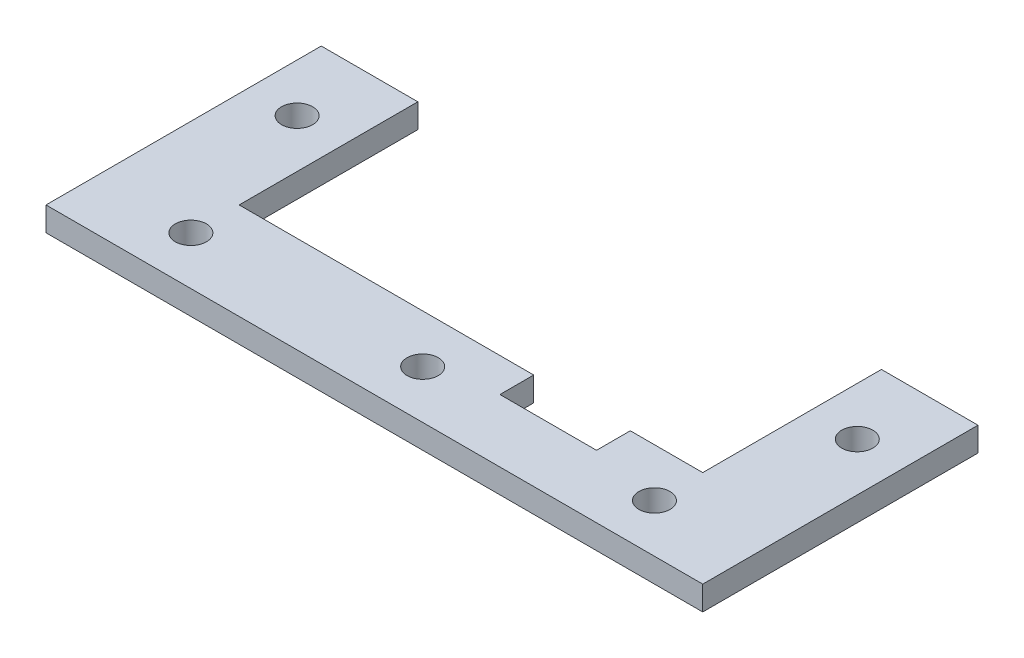
ISO-10303-21;
HEADER;
FILE_DESCRIPTION(('STEP AP214'),'2;1');
FILE_NAME('part.step','',(''),(''),'','','');
FILE_SCHEMA(('AUTOMOTIVE_DESIGN { 1 0 10303 214 1 1 1 1 }'));
ENDSEC;
DATA;
#1=APPLICATION_CONTEXT('core data for automotive mechanical design processes');
#2=APPLICATION_PROTOCOL_DEFINITION('international standard','automotive_design',2000,#1);
#3=PRODUCT_CONTEXT('',#1,'mechanical');
#4=PRODUCT('Part','Part','',(#3));
#5=PRODUCT_RELATED_PRODUCT_CATEGORY('part','',(#4));
#6=PRODUCT_DEFINITION_FORMATION('','',#4);
#7=PRODUCT_DEFINITION_CONTEXT('part definition',#1,'design');
#8=PRODUCT_DEFINITION('design','',#6,#7);
#9=PRODUCT_DEFINITION_SHAPE('','',#8);
#10=(LENGTH_UNIT() NAMED_UNIT(*) SI_UNIT(.MILLI.,.METRE.));
#11=(NAMED_UNIT(*) PLANE_ANGLE_UNIT() SI_UNIT($,.RADIAN.));
#12=(NAMED_UNIT(*) SI_UNIT($,.STERADIAN.) SOLID_ANGLE_UNIT());
#13=UNCERTAINTY_MEASURE_WITH_UNIT(LENGTH_MEASURE(1.E-05),#10,'distance_accuracy_value','');
#14=(GEOMETRIC_REPRESENTATION_CONTEXT(3) GLOBAL_UNCERTAINTY_ASSIGNED_CONTEXT((#13)) GLOBAL_UNIT_ASSIGNED_CONTEXT((#10,
#11,#12)) REPRESENTATION_CONTEXT('',''));
#15=CARTESIAN_POINT('',(0.,0.,0.));
#16=DIRECTION('',(0.,0.,1.));
#17=DIRECTION('',(1.,0.,0.));
#18=AXIS2_PLACEMENT_3D('',#15,#16,#17);
#19=CARTESIAN_POINT('',(0.,5.,37.));
#20=DIRECTION('',(0.,0.,1.));
#21=DIRECTION('',(1.,0.,0.));
#22=AXIS2_PLACEMENT_3D('',#19,#20,#21);
#23=PLANE('',#22);
#24=DIRECTION('',(-1.,0.,0.));
#25=VECTOR('',#24,1.);
#26=CARTESIAN_POINT('',(0.,0.,37.));
#27=LINE('',#26,#25);
#28=CARTESIAN_POINT('',(96.,0.,37.));
#29=VERTEX_POINT('',#28);
#30=CARTESIAN_POINT('',(81.,0.,37.));
#31=VERTEX_POINT('',#30);
#32=EDGE_CURVE('E181',#29,#31,#27,.T.);
#33=ORIENTED_EDGE('',*,*,#32,.T.);
#34=DIRECTION('',(0.,1.,0.));
#35=VECTOR('',#34,1.);
#36=CARTESIAN_POINT('',(81.,0.,37.));
#37=LINE('',#36,#35);
#38=CARTESIAN_POINT('',(81.,5.,37.));
#39=VERTEX_POINT('',#38);
#40=EDGE_CURVE('E229',#31,#39,#37,.T.);
#41=ORIENTED_EDGE('',*,*,#40,.T.);
#42=DIRECTION('',(-1.,0.,0.));
#43=VECTOR('',#42,1.);
#44=CARTESIAN_POINT('',(0.,5.,37.));
#45=LINE('',#44,#43);
#46=CARTESIAN_POINT('',(96.,5.,37.));
#47=VERTEX_POINT('',#46);
#48=EDGE_CURVE('E153',#47,#39,#45,.T.);
#49=ORIENTED_EDGE('',*,*,#48,.F.);
#50=DIRECTION('',(0.,-1.,0.));
#51=VECTOR('',#50,1.);
#52=CARTESIAN_POINT('',(96.,5.,37.));
#53=LINE('',#52,#51);
#54=EDGE_CURVE('E145',#47,#29,#53,.T.);
#55=ORIENTED_EDGE('',*,*,#54,.T.);
#56=EDGE_LOOP('',(#33,#41,#49,#55));
#57=FACE_BOUND('',#56,.T.);
#58=ADVANCED_FACE('F38',(#57),#23,.F.);
#59=CARTESIAN_POINT('',(0.,5.,0.));
#60=DIRECTION('',(-1.,0.,0.));
#61=DIRECTION('',(0.,0.,1.));
#62=AXIS2_PLACEMENT_3D('',#59,#60,#61);
#63=PLANE('',#62);
#64=DIRECTION('',(0.,0.,-1.));
#65=VECTOR('',#64,1.);
#66=CARTESIAN_POINT('',(0.,0.,0.));
#67=LINE('',#66,#65);
#68=CARTESIAN_POINT('',(0.,0.,37.));
#69=VERTEX_POINT('',#68);
#70=CARTESIAN_POINT('',(0.,0.,0.));
#71=VERTEX_POINT('',#70);
#72=EDGE_CURVE('E159',#69,#71,#67,.T.);
#73=ORIENTED_EDGE('',*,*,#72,.T.);
#74=DIRECTION('',(0.,-1.,0.));
#75=VECTOR('',#74,1.);
#76=CARTESIAN_POINT('',(0.,5.,0.));
#77=LINE('',#76,#75);
#78=CARTESIAN_POINT('',(0.,5.,0.));
#79=VERTEX_POINT('',#78);
#80=EDGE_CURVE('E11',#79,#71,#77,.T.);
#81=ORIENTED_EDGE('',*,*,#80,.F.);
#82=DIRECTION('',(0.,0.,-1.));
#83=VECTOR('',#82,1.);
#84=CARTESIAN_POINT('',(0.,5.,0.));
#85=LINE('',#84,#83);
#86=CARTESIAN_POINT('',(0.,5.,37.));
#87=VERTEX_POINT('',#86);
#88=EDGE_CURVE('E185',#87,#79,#85,.T.);
#89=ORIENTED_EDGE('',*,*,#88,.F.);
#90=DIRECTION('',(0.,-1.,0.));
#91=VECTOR('',#90,1.);
#92=CARTESIAN_POINT('',(0.,5.,37.));
#93=LINE('',#92,#91);
#94=EDGE_CURVE('E158',#87,#69,#93,.T.);
#95=ORIENTED_EDGE('',*,*,#94,.T.);
#96=EDGE_LOOP('',(#73,#81,#89,#95));
#97=FACE_BOUND('',#96,.T.);
#98=ADVANCED_FACE('F40',(#97),#63,.F.);
#99=CARTESIAN_POINT('',(0.,5.,0.));
#100=DIRECTION('',(0.,0.,1.));
#101=DIRECTION('',(1.,0.,0.));
#102=AXIS2_PLACEMENT_3D('',#99,#100,#101);
#103=PLANE('',#102);
#104=DIRECTION('',(-1.,0.,0.));
#105=VECTOR('',#104,1.);
#106=CARTESIAN_POINT('',(0.,0.,0.));
#107=LINE('',#106,#105);
#108=CARTESIAN_POINT('',(-20.,0.,0.));
#109=VERTEX_POINT('',#108);
#110=EDGE_CURVE('E163',#71,#109,#107,.T.);
#111=ORIENTED_EDGE('',*,*,#110,.T.);
#112=DIRECTION('',(0.,-1.,0.));
#113=VECTOR('',#112,1.);
#114=CARTESIAN_POINT('',(-20.,5.,0.));
#115=LINE('',#114,#113);
#116=CARTESIAN_POINT('',(-20.,5.,0.));
#117=VERTEX_POINT('',#116);
#118=EDGE_CURVE('E47',#117,#109,#115,.T.);
#119=ORIENTED_EDGE('',*,*,#118,.F.);
#120=DIRECTION('',(-1.,0.,0.));
#121=VECTOR('',#120,1.);
#122=CARTESIAN_POINT('',(0.,5.,0.));
#123=LINE('',#122,#121);
#124=EDGE_CURVE('E105',#79,#117,#123,.T.);
#125=ORIENTED_EDGE('',*,*,#124,.F.);
#126=ORIENTED_EDGE('',*,*,#80,.T.);
#127=EDGE_LOOP('',(#111,#119,#125,#126));
#128=FACE_BOUND('',#127,.T.);
#129=ADVANCED_FACE('F353',(#128),#103,.F.);
#130=CARTESIAN_POINT('',(-20.,5.,0.));
#131=DIRECTION('',(1.,0.,0.));
#132=DIRECTION('',(0.,0.,-1.));
#133=AXIS2_PLACEMENT_3D('',#130,#131,#132);
#134=PLANE('',#133);
#135=DIRECTION('',(0.,0.,1.));
#136=VECTOR('',#135,1.);
#137=CARTESIAN_POINT('',(-20.,0.,0.));
#138=LINE('',#137,#136);
#139=CARTESIAN_POINT('',(-20.,0.,57.));
#140=VERTEX_POINT('',#139);
#141=EDGE_CURVE('E167',#109,#140,#138,.T.);
#142=ORIENTED_EDGE('',*,*,#141,.T.);
#143=DIRECTION('',(0.,-1.,0.));
#144=VECTOR('',#143,1.);
#145=CARTESIAN_POINT('',(-20.,5.,57.));
#146=LINE('',#145,#144);
#147=CARTESIAN_POINT('',(-20.,5.,57.));
#148=VERTEX_POINT('',#147);
#149=EDGE_CURVE('E196',#148,#140,#146,.T.);
#150=ORIENTED_EDGE('',*,*,#149,.F.);
#151=DIRECTION('',(0.,0.,1.));
#152=VECTOR('',#151,1.);
#153=CARTESIAN_POINT('',(-20.,5.,0.));
#154=LINE('',#153,#152);
#155=EDGE_CURVE('E206',#117,#148,#154,.T.);
#156=ORIENTED_EDGE('',*,*,#155,.F.);
#157=ORIENTED_EDGE('',*,*,#118,.T.);
#158=EDGE_LOOP('',(#142,#150,#156,#157));
#159=FACE_BOUND('',#158,.T.);
#160=ADVANCED_FACE('F204',(#159),#134,.F.);
#161=CARTESIAN_POINT('',(-20.,5.,57.));
#162=DIRECTION('',(0.,0.,-1.));
#163=DIRECTION('',(-1.,0.,0.));
#164=AXIS2_PLACEMENT_3D('',#161,#162,#163);
#165=PLANE('',#164);
#166=DIRECTION('',(1.,0.,0.));
#167=VECTOR('',#166,1.);
#168=CARTESIAN_POINT('',(-20.,0.,57.));
#169=LINE('',#168,#167);
#170=CARTESIAN_POINT('',(116.,0.,57.));
#171=VERTEX_POINT('',#170);
#172=EDGE_CURVE('E170',#140,#171,#169,.T.);
#173=ORIENTED_EDGE('',*,*,#172,.T.);
#174=DIRECTION('',(0.,-1.,0.));
#175=VECTOR('',#174,1.);
#176=CARTESIAN_POINT('',(116.,5.,57.));
#177=LINE('',#176,#175);
#178=CARTESIAN_POINT('',(116.,5.,57.));
#179=VERTEX_POINT('',#178);
#180=EDGE_CURVE('E192',#179,#171,#177,.T.);
#181=ORIENTED_EDGE('',*,*,#180,.F.);
#182=DIRECTION('',(1.,0.,0.));
#183=VECTOR('',#182,1.);
#184=CARTESIAN_POINT('',(-20.,5.,57.));
#185=LINE('',#184,#183);
#186=EDGE_CURVE('E219',#148,#179,#185,.T.);
#187=ORIENTED_EDGE('',*,*,#186,.F.);
#188=ORIENTED_EDGE('',*,*,#149,.T.);
#189=EDGE_LOOP('',(#173,#181,#187,#188));
#190=FACE_BOUND('',#189,.T.);
#191=ADVANCED_FACE('F214',(#190),#165,.F.);
#192=CARTESIAN_POINT('',(116.,5.,57.));
#193=DIRECTION('',(-1.,0.,0.));
#194=DIRECTION('',(0.,0.,1.));
#195=AXIS2_PLACEMENT_3D('',#192,#193,#194);
#196=PLANE('',#195);
#197=DIRECTION('',(0.,0.,-1.));
#198=VECTOR('',#197,1.);
#199=CARTESIAN_POINT('',(116.,0.,57.));
#200=LINE('',#199,#198);
#201=CARTESIAN_POINT('',(116.,0.,0.));
#202=VERTEX_POINT('',#201);
#203=EDGE_CURVE('E173',#171,#202,#200,.T.);
#204=ORIENTED_EDGE('',*,*,#203,.T.);
#205=DIRECTION('',(0.,-1.,0.));
#206=VECTOR('',#205,1.);
#207=CARTESIAN_POINT('',(116.,5.,0.));
#208=LINE('',#207,#206);
#209=CARTESIAN_POINT('',(116.,5.,0.));
#210=VERTEX_POINT('',#209);
#211=EDGE_CURVE('E144',#210,#202,#208,.T.);
#212=ORIENTED_EDGE('',*,*,#211,.F.);
#213=DIRECTION('',(0.,0.,-1.));
#214=VECTOR('',#213,1.);
#215=CARTESIAN_POINT('',(116.,5.,57.));
#216=LINE('',#215,#214);
#217=EDGE_CURVE('E130',#179,#210,#216,.T.);
#218=ORIENTED_EDGE('',*,*,#217,.F.);
#219=ORIENTED_EDGE('',*,*,#180,.T.);
#220=EDGE_LOOP('',(#204,#212,#218,#219));
#221=FACE_BOUND('',#220,.T.);
#222=ADVANCED_FACE('F217',(#221),#196,.F.);
#223=CARTESIAN_POINT('',(116.,5.,0.));
#224=DIRECTION('',(0.,0.,1.));
#225=DIRECTION('',(1.,0.,0.));
#226=AXIS2_PLACEMENT_3D('',#223,#224,#225);
#227=PLANE('',#226);
#228=DIRECTION('',(-1.,0.,0.));
#229=VECTOR('',#228,1.);
#230=CARTESIAN_POINT('',(116.,0.,0.));
#231=LINE('',#230,#229);
#232=CARTESIAN_POINT('',(96.,0.,0.));
#233=VERTEX_POINT('',#232);
#234=EDGE_CURVE('E140',#202,#233,#231,.T.);
#235=ORIENTED_EDGE('',*,*,#234,.T.);
#236=DIRECTION('',(0.,-1.,0.));
#237=VECTOR('',#236,1.);
#238=CARTESIAN_POINT('',(96.,5.,0.));
#239=LINE('',#238,#237);
#240=CARTESIAN_POINT('',(96.,5.,0.));
#241=VERTEX_POINT('',#240);
#242=EDGE_CURVE('E137',#241,#233,#239,.T.);
#243=ORIENTED_EDGE('',*,*,#242,.F.);
#244=DIRECTION('',(-1.,0.,0.));
#245=VECTOR('',#244,1.);
#246=CARTESIAN_POINT('',(116.,5.,0.));
#247=LINE('',#246,#245);
#248=EDGE_CURVE('E121',#210,#241,#247,.T.);
#249=ORIENTED_EDGE('',*,*,#248,.F.);
#250=ORIENTED_EDGE('',*,*,#211,.T.);
#251=EDGE_LOOP('',(#235,#243,#249,#250));
#252=FACE_BOUND('',#251,.T.);
#253=ADVANCED_FACE('F138',(#252),#227,.F.);
#254=CARTESIAN_POINT('',(96.,5.,0.));
#255=DIRECTION('',(1.,0.,0.));
#256=DIRECTION('',(0.,0.,-1.));
#257=AXIS2_PLACEMENT_3D('',#254,#255,#256);
#258=PLANE('',#257);
#259=DIRECTION('',(0.,0.,1.));
#260=VECTOR('',#259,1.);
#261=CARTESIAN_POINT('',(96.,0.,0.));
#262=LINE('',#261,#260);
#263=EDGE_CURVE('E178',#233,#29,#262,.T.);
#264=ORIENTED_EDGE('',*,*,#263,.T.);
#265=ORIENTED_EDGE('',*,*,#54,.F.);
#266=DIRECTION('',(0.,0.,1.));
#267=VECTOR('',#266,1.);
#268=CARTESIAN_POINT('',(96.,5.,0.));
#269=LINE('',#268,#267);
#270=EDGE_CURVE('E127',#241,#47,#269,.T.);
#271=ORIENTED_EDGE('',*,*,#270,.F.);
#272=ORIENTED_EDGE('',*,*,#242,.T.);
#273=EDGE_LOOP('',(#264,#265,#271,#272));
#274=FACE_BOUND('',#273,.T.);
#275=ADVANCED_FACE('F147',(#274),#258,.F.);
#276=CARTESIAN_POINT('',(61.,5.,37.));
#277=VERTEX_POINT('',#276);
#278=EDGE_CURVE('E63',#277,#87,#45,.T.);
#279=ORIENTED_EDGE('',*,*,#278,.F.);
#280=DIRECTION('',(0.,1.,0.));
#281=VECTOR('',#280,1.);
#282=CARTESIAN_POINT('',(61.,0.,37.));
#283=LINE('',#282,#281);
#284=CARTESIAN_POINT('',(61.,0.,37.));
#285=VERTEX_POINT('',#284);
#286=EDGE_CURVE('E233',#285,#277,#283,.T.);
#287=ORIENTED_EDGE('',*,*,#286,.F.);
#288=EDGE_CURVE('E97',#285,#69,#27,.T.);
#289=ORIENTED_EDGE('',*,*,#288,.T.);
#290=ORIENTED_EDGE('',*,*,#94,.F.);
#291=EDGE_LOOP('',(#279,#287,#289,#290));
#292=FACE_BOUND('',#291,.T.);
#293=ADVANCED_FACE('F317',(#292),#23,.F.);
#294=CARTESIAN_POINT('',(0.,5.,0.));
#295=DIRECTION('',(0.,1.,0.));
#296=DIRECTION('',(0.,0.,1.));
#297=AXIS2_PLACEMENT_3D('',#294,#295,#296);
#298=PLANE('',#297);
#299=CARTESIAN_POINT('',(-10.,5.,15.));
#300=DIRECTION('',(0.,1.,0.));
#301=DIRECTION('',(0.,0.,1.));
#302=AXIS2_PLACEMENT_3D('',#299,#300,#301);
#303=CIRCLE('',#302,3.225);
#304=CARTESIAN_POINT('',(-10.,5.,18.225));
#305=VERTEX_POINT('',#304);
#306=EDGE_CURVE('E298',#305,#305,#303,.T.);
#307=ORIENTED_EDGE('',*,*,#306,.F.);
#308=EDGE_LOOP('',(#307));
#309=FACE_BOUND('',#308,.T.);
#310=CARTESIAN_POINT('',(0.,5.,47.));
#311=DIRECTION('',(0.,1.,0.));
#312=DIRECTION('',(0.,0.,1.));
#313=AXIS2_PLACEMENT_3D('',#310,#311,#312);
#314=CIRCLE('',#313,3.225);
#315=CARTESIAN_POINT('',(0.,5.,50.225));
#316=VERTEX_POINT('',#315);
#317=EDGE_CURVE('E290',#316,#316,#314,.T.);
#318=ORIENTED_EDGE('',*,*,#317,.F.);
#319=EDGE_LOOP('',(#318));
#320=FACE_BOUND('',#319,.T.);
#321=CARTESIAN_POINT('',(48.,5.,47.));
#322=DIRECTION('',(0.,1.,0.));
#323=DIRECTION('',(0.,0.,1.));
#324=AXIS2_PLACEMENT_3D('',#321,#322,#323);
#325=CIRCLE('',#324,3.225);
#326=CARTESIAN_POINT('',(48.,5.,50.225));
#327=VERTEX_POINT('',#326);
#328=EDGE_CURVE('E282',#327,#327,#325,.T.);
#329=ORIENTED_EDGE('',*,*,#328,.F.);
#330=EDGE_LOOP('',(#329));
#331=FACE_BOUND('',#330,.T.);
#332=CARTESIAN_POINT('',(96.,5.,47.));
#333=DIRECTION('',(0.,1.,0.));
#334=DIRECTION('',(0.,0.,1.));
#335=AXIS2_PLACEMENT_3D('',#332,#333,#334);
#336=CIRCLE('',#335,3.22500000000001);
#337=CARTESIAN_POINT('',(96.,5.,50.225));
#338=VERTEX_POINT('',#337);
#339=EDGE_CURVE('E274',#338,#338,#336,.T.);
#340=ORIENTED_EDGE('',*,*,#339,.F.);
#341=EDGE_LOOP('',(#340));
#342=FACE_BOUND('',#341,.T.);
#343=CARTESIAN_POINT('',(106.,5.,15.));
#344=DIRECTION('',(0.,1.,0.));
#345=DIRECTION('',(0.,0.,1.));
#346=AXIS2_PLACEMENT_3D('',#343,#344,#345);
#347=CIRCLE('',#346,3.22500000000001);
#348=CARTESIAN_POINT('',(106.,5.,18.225));
#349=VERTEX_POINT('',#348);
#350=EDGE_CURVE('E266',#349,#349,#347,.T.);
#351=ORIENTED_EDGE('',*,*,#350,.F.);
#352=EDGE_LOOP('',(#351));
#353=FACE_BOUND('',#352,.T.);
#354=DIRECTION('',(0.,0.,-1.));
#355=VECTOR('',#354,1.);
#356=CARTESIAN_POINT('',(81.,5.,37.));
#357=LINE('',#356,#355);
#358=CARTESIAN_POINT('',(81.,5.,44.));
#359=VERTEX_POINT('',#358);
#360=EDGE_CURVE('E252',#359,#39,#357,.T.);
#361=ORIENTED_EDGE('',*,*,#360,.F.);
#362=DIRECTION('',(1.,0.,0.));
#363=VECTOR('',#362,1.);
#364=CARTESIAN_POINT('',(81.,5.,44.));
#365=LINE('',#364,#363);
#366=CARTESIAN_POINT('',(61.,5.,44.));
#367=VERTEX_POINT('',#366);
#368=EDGE_CURVE('E243',#367,#359,#365,.T.);
#369=ORIENTED_EDGE('',*,*,#368,.F.);
#370=DIRECTION('',(0.,0.,1.));
#371=VECTOR('',#370,1.);
#372=CARTESIAN_POINT('',(61.,5.,37.));
#373=LINE('',#372,#371);
#374=EDGE_CURVE('E248',#277,#367,#373,.T.);
#375=ORIENTED_EDGE('',*,*,#374,.F.);
#376=ORIENTED_EDGE('',*,*,#278,.T.);
#377=ORIENTED_EDGE('',*,*,#88,.T.);
#378=ORIENTED_EDGE('',*,*,#124,.T.);
#379=ORIENTED_EDGE('',*,*,#155,.T.);
#380=ORIENTED_EDGE('',*,*,#186,.T.);
#381=ORIENTED_EDGE('',*,*,#217,.T.);
#382=ORIENTED_EDGE('',*,*,#248,.T.);
#383=ORIENTED_EDGE('',*,*,#270,.T.);
#384=ORIENTED_EDGE('',*,*,#48,.T.);
#385=EDGE_LOOP('',(#361,#369,#375,#376,#377,#378,#379,#380,#381,#382,#383,#384));
#386=FACE_BOUND('',#385,.T.);
#387=ADVANCED_FACE('F124',(#309,#320,#331,#342,#353,#386),#298,.T.);
#388=CARTESIAN_POINT('',(0.,0.,0.));
#389=DIRECTION('',(0.,1.,0.));
#390=DIRECTION('',(0.,0.,1.));
#391=AXIS2_PLACEMENT_3D('',#388,#389,#390);
#392=PLANE('',#391);
#393=CARTESIAN_POINT('',(-10.,0.,15.));
#394=DIRECTION('',(0.,1.,0.));
#395=DIRECTION('',(0.,0.,1.));
#396=AXIS2_PLACEMENT_3D('',#393,#394,#395);
#397=CIRCLE('',#396,3.225);
#398=CARTESIAN_POINT('',(-10.,0.,18.225));
#399=VERTEX_POINT('',#398);
#400=EDGE_CURVE('E256',#399,#399,#397,.T.);
#401=ORIENTED_EDGE('',*,*,#400,.T.);
#402=EDGE_LOOP('',(#401));
#403=FACE_BOUND('',#402,.T.);
#404=CARTESIAN_POINT('',(0.,0.,47.));
#405=DIRECTION('',(0.,1.,0.));
#406=DIRECTION('',(0.,0.,1.));
#407=AXIS2_PLACEMENT_3D('',#404,#405,#406);
#408=CIRCLE('',#407,3.225);
#409=CARTESIAN_POINT('',(0.,0.,50.225));
#410=VERTEX_POINT('',#409);
#411=EDGE_CURVE('E294',#410,#410,#408,.T.);
#412=ORIENTED_EDGE('',*,*,#411,.T.);
#413=EDGE_LOOP('',(#412));
#414=FACE_BOUND('',#413,.T.);
#415=CARTESIAN_POINT('',(48.,0.,47.));
#416=DIRECTION('',(0.,1.,0.));
#417=DIRECTION('',(0.,0.,1.));
#418=AXIS2_PLACEMENT_3D('',#415,#416,#417);
#419=CIRCLE('',#418,3.225);
#420=CARTESIAN_POINT('',(48.,0.,50.225));
#421=VERTEX_POINT('',#420);
#422=EDGE_CURVE('E286',#421,#421,#419,.T.);
#423=ORIENTED_EDGE('',*,*,#422,.T.);
#424=EDGE_LOOP('',(#423));
#425=FACE_BOUND('',#424,.T.);
#426=CARTESIAN_POINT('',(96.,0.,47.));
#427=DIRECTION('',(0.,1.,0.));
#428=DIRECTION('',(0.,0.,1.));
#429=AXIS2_PLACEMENT_3D('',#426,#427,#428);
#430=CIRCLE('',#429,3.22500000000001);
#431=CARTESIAN_POINT('',(96.,0.,50.225));
#432=VERTEX_POINT('',#431);
#433=EDGE_CURVE('E278',#432,#432,#430,.T.);
#434=ORIENTED_EDGE('',*,*,#433,.T.);
#435=EDGE_LOOP('',(#434));
#436=FACE_BOUND('',#435,.T.);
#437=CARTESIAN_POINT('',(106.,0.,15.));
#438=DIRECTION('',(0.,1.,0.));
#439=DIRECTION('',(0.,0.,1.));
#440=AXIS2_PLACEMENT_3D('',#437,#438,#439);
#441=CIRCLE('',#440,3.22500000000001);
#442=CARTESIAN_POINT('',(106.,0.,18.225));
#443=VERTEX_POINT('',#442);
#444=EDGE_CURVE('E270',#443,#443,#441,.T.);
#445=ORIENTED_EDGE('',*,*,#444,.T.);
#446=EDGE_LOOP('',(#445));
#447=FACE_BOUND('',#446,.T.);
#448=DIRECTION('',(1.,0.,0.));
#449=VECTOR('',#448,1.);
#450=CARTESIAN_POINT('',(81.,0.,44.));
#451=LINE('',#450,#449);
#452=CARTESIAN_POINT('',(61.,0.,44.));
#453=VERTEX_POINT('',#452);
#454=CARTESIAN_POINT('',(81.,0.,44.));
#455=VERTEX_POINT('',#454);
#456=EDGE_CURVE('E54',#453,#455,#451,.T.);
#457=ORIENTED_EDGE('',*,*,#456,.T.);
#458=DIRECTION('',(0.,0.,-1.));
#459=VECTOR('',#458,1.);
#460=CARTESIAN_POINT('',(81.,0.,37.));
#461=LINE('',#460,#459);
#462=EDGE_CURVE('E247',#455,#31,#461,.T.);
#463=ORIENTED_EDGE('',*,*,#462,.T.);
#464=ORIENTED_EDGE('',*,*,#32,.F.);
#465=ORIENTED_EDGE('',*,*,#263,.F.);
#466=ORIENTED_EDGE('',*,*,#234,.F.);
#467=ORIENTED_EDGE('',*,*,#203,.F.);
#468=ORIENTED_EDGE('',*,*,#172,.F.);
#469=ORIENTED_EDGE('',*,*,#141,.F.);
#470=ORIENTED_EDGE('',*,*,#110,.F.);
#471=ORIENTED_EDGE('',*,*,#72,.F.);
#472=ORIENTED_EDGE('',*,*,#288,.F.);
#473=DIRECTION('',(0.,0.,1.));
#474=VECTOR('',#473,1.);
#475=CARTESIAN_POINT('',(61.,0.,37.));
#476=LINE('',#475,#474);
#477=EDGE_CURVE('E259',#285,#453,#476,.T.);
#478=ORIENTED_EDGE('',*,*,#477,.T.);
#479=EDGE_LOOP('',(#457,#463,#464,#465,#466,#467,#468,#469,#470,#471,#472,#478));
#480=FACE_BOUND('',#479,.T.);
#481=ADVANCED_FACE('F209',(#403,#414,#425,#436,#447,#480),#392,.F.);
#482=CARTESIAN_POINT('',(81.,0.,37.));
#483=DIRECTION('',(1.,0.,0.));
#484=DIRECTION('',(0.,0.,-1.));
#485=AXIS2_PLACEMENT_3D('',#482,#483,#484);
#486=PLANE('',#485);
#487=ORIENTED_EDGE('',*,*,#360,.T.);
#488=ORIENTED_EDGE('',*,*,#40,.F.);
#489=ORIENTED_EDGE('',*,*,#462,.F.);
#490=DIRECTION('',(0.,1.,0.));
#491=VECTOR('',#490,1.);
#492=CARTESIAN_POINT('',(81.,0.,44.));
#493=LINE('',#492,#491);
#494=EDGE_CURVE('E164',#455,#359,#493,.T.);
#495=ORIENTED_EDGE('',*,*,#494,.T.);
#496=EDGE_LOOP('',(#487,#488,#489,#495));
#497=FACE_BOUND('',#496,.T.);
#498=ADVANCED_FACE('F376',(#497),#486,.F.);
#499=CARTESIAN_POINT('',(81.,0.,44.));
#500=DIRECTION('',(0.,0.,1.));
#501=DIRECTION('',(1.,0.,0.));
#502=AXIS2_PLACEMENT_3D('',#499,#500,#501);
#503=PLANE('',#502);
#504=ORIENTED_EDGE('',*,*,#368,.T.);
#505=ORIENTED_EDGE('',*,*,#494,.F.);
#506=ORIENTED_EDGE('',*,*,#456,.F.);
#507=DIRECTION('',(0.,1.,0.));
#508=VECTOR('',#507,1.);
#509=CARTESIAN_POINT('',(61.,0.,44.));
#510=LINE('',#509,#508);
#511=EDGE_CURVE('E237',#453,#367,#510,.T.);
#512=ORIENTED_EDGE('',*,*,#511,.T.);
#513=EDGE_LOOP('',(#504,#505,#506,#512));
#514=FACE_BOUND('',#513,.T.);
#515=ADVANCED_FACE('F340',(#514),#503,.F.);
#516=CARTESIAN_POINT('',(61.,0.,37.));
#517=DIRECTION('',(-1.,0.,0.));
#518=DIRECTION('',(0.,0.,1.));
#519=AXIS2_PLACEMENT_3D('',#516,#517,#518);
#520=PLANE('',#519);
#521=ORIENTED_EDGE('',*,*,#374,.T.);
#522=ORIENTED_EDGE('',*,*,#511,.F.);
#523=ORIENTED_EDGE('',*,*,#477,.F.);
#524=ORIENTED_EDGE('',*,*,#286,.T.);
#525=EDGE_LOOP('',(#521,#522,#523,#524));
#526=FACE_BOUND('',#525,.T.);
#527=ADVANCED_FACE('F330',(#526),#520,.F.);
#528=CARTESIAN_POINT('',(106.,0.,15.));
#529=DIRECTION('',(0.,1.,0.));
#530=DIRECTION('',(0.,0.,1.));
#531=AXIS2_PLACEMENT_3D('',#528,#529,#530);
#532=CYLINDRICAL_SURFACE('',#531,3.22500000000001);
#533=ORIENTED_EDGE('',*,*,#444,.F.);
#534=EDGE_LOOP('',(#533));
#535=FACE_BOUND('',#534,.T.);
#536=ORIENTED_EDGE('',*,*,#350,.T.);
#537=EDGE_LOOP('',(#536));
#538=FACE_BOUND('',#537,.T.);
#539=ADVANCED_FACE('F327',(#535,#538),#532,.F.);
#540=CARTESIAN_POINT('',(96.,0.,47.));
#541=DIRECTION('',(0.,1.,0.));
#542=DIRECTION('',(0.,0.,1.));
#543=AXIS2_PLACEMENT_3D('',#540,#541,#542);
#544=CYLINDRICAL_SURFACE('',#543,3.22500000000001);
#545=ORIENTED_EDGE('',*,*,#433,.F.);
#546=EDGE_LOOP('',(#545));
#547=FACE_BOUND('',#546,.T.);
#548=ORIENTED_EDGE('',*,*,#339,.T.);
#549=EDGE_LOOP('',(#548));
#550=FACE_BOUND('',#549,.T.);
#551=ADVANCED_FACE('F329',(#547,#550),#544,.F.);
#552=CARTESIAN_POINT('',(48.,0.,47.));
#553=DIRECTION('',(0.,1.,0.));
#554=DIRECTION('',(0.,0.,1.));
#555=AXIS2_PLACEMENT_3D('',#552,#553,#554);
#556=CYLINDRICAL_SURFACE('',#555,3.225);
#557=ORIENTED_EDGE('',*,*,#422,.F.);
#558=EDGE_LOOP('',(#557));
#559=FACE_BOUND('',#558,.T.);
#560=ORIENTED_EDGE('',*,*,#328,.T.);
#561=EDGE_LOOP('',(#560));
#562=FACE_BOUND('',#561,.T.);
#563=ADVANCED_FACE('F337',(#559,#562),#556,.F.);
#564=CARTESIAN_POINT('',(0.,0.,47.));
#565=DIRECTION('',(0.,1.,0.));
#566=DIRECTION('',(0.,0.,1.));
#567=AXIS2_PLACEMENT_3D('',#564,#565,#566);
#568=CYLINDRICAL_SURFACE('',#567,3.225);
#569=ORIENTED_EDGE('',*,*,#411,.F.);
#570=EDGE_LOOP('',(#569));
#571=FACE_BOUND('',#570,.T.);
#572=ORIENTED_EDGE('',*,*,#317,.T.);
#573=EDGE_LOOP('',(#572));
#574=FACE_BOUND('',#573,.T.);
#575=ADVANCED_FACE('F311',(#571,#574),#568,.F.);
#576=CARTESIAN_POINT('',(-10.,0.,15.));
#577=DIRECTION('',(0.,1.,0.));
#578=DIRECTION('',(0.,0.,1.));
#579=AXIS2_PLACEMENT_3D('',#576,#577,#578);
#580=CYLINDRICAL_SURFACE('',#579,3.225);
#581=ORIENTED_EDGE('',*,*,#400,.F.);
#582=EDGE_LOOP('',(#581));
#583=FACE_BOUND('',#582,.T.);
#584=ORIENTED_EDGE('',*,*,#306,.T.);
#585=EDGE_LOOP('',(#584));
#586=FACE_BOUND('',#585,.T.);
#587=ADVANCED_FACE('F308',(#583,#586),#580,.F.);
#588=CLOSED_SHELL('',(#58,#98,#129,#160,#191,#222,#253,#275,#293,#387,#481,#498,#515,#527,#539,
#551,#563,#575,#587));
#589=MANIFOLD_SOLID_BREP('B2',#588);
#590=ADVANCED_BREP_SHAPE_REPRESENTATION('',(#18,#589),#14);
#591=SHAPE_DEFINITION_REPRESENTATION(#9,#590);
ENDSEC;
END-ISO-10303-21;
